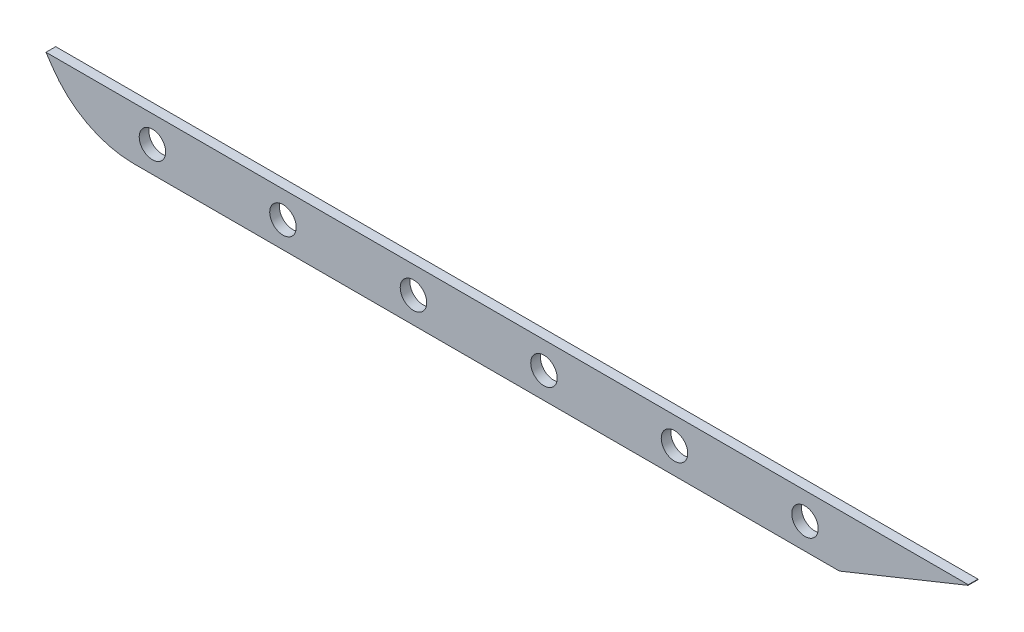
ISO-10303-21;
HEADER;
FILE_DESCRIPTION(('STEP AP214'),'2;1');
FILE_NAME('part.step','',(''),(''),'','','');
FILE_SCHEMA(('AUTOMOTIVE_DESIGN { 1 0 10303 214 1 1 1 1 }'));
ENDSEC;
DATA;
#1=APPLICATION_CONTEXT('core data for automotive mechanical design processes');
#2=APPLICATION_PROTOCOL_DEFINITION('international standard','automotive_design',2000,#1);
#3=PRODUCT_CONTEXT('',#1,'mechanical');
#4=PRODUCT('Part','Part','',(#3));
#5=PRODUCT_RELATED_PRODUCT_CATEGORY('part','',(#4));
#6=PRODUCT_DEFINITION_FORMATION('','',#4);
#7=PRODUCT_DEFINITION_CONTEXT('part definition',#1,'design');
#8=PRODUCT_DEFINITION('design','',#6,#7);
#9=PRODUCT_DEFINITION_SHAPE('','',#8);
#10=(LENGTH_UNIT() NAMED_UNIT(*) SI_UNIT(.MILLI.,.METRE.));
#11=(NAMED_UNIT(*) PLANE_ANGLE_UNIT() SI_UNIT($,.RADIAN.));
#12=(NAMED_UNIT(*) SI_UNIT($,.STERADIAN.) SOLID_ANGLE_UNIT());
#13=UNCERTAINTY_MEASURE_WITH_UNIT(LENGTH_MEASURE(1.E-05),#10,'distance_accuracy_value','');
#14=(GEOMETRIC_REPRESENTATION_CONTEXT(3) GLOBAL_UNCERTAINTY_ASSIGNED_CONTEXT((#13)) GLOBAL_UNIT_ASSIGNED_CONTEXT((#10,
#11,#12)) REPRESENTATION_CONTEXT('',''));
#15=CARTESIAN_POINT('',(0.,0.,0.));
#16=DIRECTION('',(0.,0.,1.));
#17=DIRECTION('',(1.,0.,0.));
#18=AXIS2_PLACEMENT_3D('',#15,#16,#17);
#19=CARTESIAN_POINT('',(428.120588235294,28.9396179466764,4.7625));
#20=DIRECTION('',(0.970193019893108,-0.242333456523632,0.));
#21=DIRECTION('',(0.242333456523632,0.970193019893108,0.));
#22=AXIS2_PLACEMENT_3D('',#19,#20,#21);
#23=PLANE('',#22);
#24=DIRECTION('',(0.,0.,1.));
#25=VECTOR('',#24,1.);
#26=CARTESIAN_POINT('',(403.198019602024,-70.8390196078432,-5.2375));
#27=LINE('',#26,#25);
#28=CARTESIAN_POINT('',(403.198019602024,-70.8390196078432,0.));
#29=VERTEX_POINT('',#28);
#30=CARTESIAN_POINT('',(403.198019602024,-70.8390196078432,4.7625));
#31=VERTEX_POINT('',#30);
#32=EDGE_CURVE('E61',#29,#31,#27,.T.);
#33=ORIENTED_EDGE('',*,*,#32,.T.);
#34=DIRECTION('',(-0.242333456523632,-0.970193019893108,0.));
#35=VECTOR('',#34,1.);
#36=CARTESIAN_POINT('',(428.120588235294,28.9396179466764,4.7625));
#37=LINE('',#36,#35);
#38=CARTESIAN_POINT('',(403.120588235294,-71.1490196078431,4.7625));
#39=VERTEX_POINT('',#38);
#40=EDGE_CURVE('E114',#31,#39,#37,.T.);
#41=ORIENTED_EDGE('',*,*,#40,.T.);
#42=DIRECTION('',(0.,0.,-1.));
#43=VECTOR('',#42,1.);
#44=CARTESIAN_POINT('',(403.120588235294,-71.1490196078431,4.7625));
#45=LINE('',#44,#43);
#46=CARTESIAN_POINT('',(403.120588235294,-71.1490196078431,0.));
#47=VERTEX_POINT('',#46);
#48=EDGE_CURVE('E122',#39,#47,#45,.T.);
#49=ORIENTED_EDGE('',*,*,#48,.T.);
#50=DIRECTION('',(-0.242333456523632,-0.970193019893108,0.));
#51=VECTOR('',#50,1.);
#52=CARTESIAN_POINT('',(428.120588235294,28.9396179466764,0.));
#53=LINE('',#52,#51);
#54=EDGE_CURVE('E134',#29,#47,#53,.T.);
#55=ORIENTED_EDGE('',*,*,#54,.F.);
#56=EDGE_LOOP('',(#33,#41,#49,#55));
#57=FACE_BOUND('',#56,.T.);
#58=ADVANCED_FACE('F45',(#57),#23,.T.);
#59=CARTESIAN_POINT('',(-98.8794117647059,3.85098039215685,4.7625));
#60=DIRECTION('',(-0.832050294337848,-0.554700196225223,0.));
#61=DIRECTION('',(0.554700196225223,-0.832050294337848,0.));
#62=AXIS2_PLACEMENT_3D('',#59,#60,#61);
#63=PLANE('',#62);
#64=DIRECTION('',(0.,0.,1.));
#65=VECTOR('',#64,1.);
#66=CARTESIAN_POINT('',(-49.0860784313726,-70.8390196078432,-5.2375));
#67=LINE('',#66,#65);
#68=CARTESIAN_POINT('',(-49.0860784313726,-70.8390196078432,0.));
#69=VERTEX_POINT('',#68);
#70=CARTESIAN_POINT('',(-49.0860784313726,-70.8390196078432,4.7625));
#71=VERTEX_POINT('',#70);
#72=EDGE_CURVE('E97',#69,#71,#67,.T.);
#73=ORIENTED_EDGE('',*,*,#72,.F.);
#74=DIRECTION('',(-0.554700196225223,0.832050294337848,0.));
#75=VECTOR('',#74,1.);
#76=CARTESIAN_POINT('',(-98.8794117647059,3.85098039215685,0.));
#77=LINE('',#76,#75);
#78=CARTESIAN_POINT('',(-46.1290054854995,-75.2746290266539,0.));
#79=VERTEX_POINT('',#78);
#80=EDGE_CURVE('E142',#79,#69,#77,.T.);
#81=ORIENTED_EDGE('',*,*,#80,.F.);
#82=DIRECTION('',(0.,0.,-1.));
#83=VECTOR('',#82,1.);
#84=CARTESIAN_POINT('',(-46.1290054854995,-75.2746290266539,4.7625));
#85=LINE('',#84,#83);
#86=CARTESIAN_POINT('',(-46.129005485499,-75.2746290266536,4.7625));
#87=VERTEX_POINT('',#86);
#88=EDGE_CURVE('E119',#79,#87,#85,.F.);
#89=ORIENTED_EDGE('',*,*,#88,.T.);
#90=DIRECTION('',(0.554700196225229,-0.832050294337844,0.));
#91=VECTOR('',#90,1.);
#92=CARTESIAN_POINT('',(-98.8794117647059,3.85098039215685,4.7625));
#93=LINE('',#92,#91);
#94=EDGE_CURVE('E111',#71,#87,#93,.T.);
#95=ORIENTED_EDGE('',*,*,#94,.F.);
#96=EDGE_LOOP('',(#73,#81,#89,#95));
#97=FACE_BOUND('',#96,.T.);
#98=ADVANCED_FACE('F117',(#97),#63,.T.);
#99=CARTESIAN_POINT('',(-31.8794117647059,-96.6490196078432,4.7625));
#100=DIRECTION('',(0.,1.,0.));
#101=DIRECTION('',(-1.,0.,0.));
#102=AXIS2_PLACEMENT_3D('',#99,#100,#101);
#103=PLANE('',#102);
#104=DIRECTION('',(1.,0.,0.));
#105=VECTOR('',#104,1.);
#106=CARTESIAN_POINT('',(-31.8794117647059,-96.6490196078432,0.));
#107=LINE('',#106,#105);
#108=CARTESIAN_POINT('',(-6.19059135728281,-96.6490196078432,0.));
#109=VERTEX_POINT('',#108);
#110=CARTESIAN_POINT('',(340.005873473177,-96.6490196078432,0.));
#111=VERTEX_POINT('',#110);
#112=EDGE_CURVE('E137',#109,#111,#107,.T.);
#113=ORIENTED_EDGE('',*,*,#112,.T.);
#114=DIRECTION('',(0.,0.,1.));
#115=VECTOR('',#114,1.);
#116=CARTESIAN_POINT('',(340.005873473177,-96.6490196078432,-5.2375));
#117=LINE('',#116,#115);
#118=CARTESIAN_POINT('',(340.005873473177,-96.6490196078432,4.7625));
#119=VERTEX_POINT('',#118);
#120=EDGE_CURVE('E68',#111,#119,#117,.T.);
#121=ORIENTED_EDGE('',*,*,#120,.T.);
#122=DIRECTION('',(1.,0.,0.));
#123=VECTOR('',#122,1.);
#124=CARTESIAN_POINT('',(-31.8794117647059,-96.6490196078432,4.7625));
#125=LINE('',#124,#123);
#126=CARTESIAN_POINT('',(-6.19059135728281,-96.6490196078432,4.7625));
#127=VERTEX_POINT('',#126);
#128=EDGE_CURVE('E123',#127,#119,#125,.T.);
#129=ORIENTED_EDGE('',*,*,#128,.F.);
#130=DIRECTION('',(0.,0.,-1.));
#131=VECTOR('',#130,1.);
#132=CARTESIAN_POINT('',(-6.19059135728281,-96.6490196078432,0.));
#133=LINE('',#132,#131);
#134=EDGE_CURVE('E128',#127,#109,#133,.T.);
#135=ORIENTED_EDGE('',*,*,#134,.T.);
#136=EDGE_LOOP('',(#113,#121,#129,#135));
#137=FACE_BOUND('',#136,.T.);
#138=ADVANCED_FACE('F162',(#137),#103,.F.);
#139=CARTESIAN_POINT('',(0.,0.,4.7625));
#140=DIRECTION('',(0.,0.,1.));
#141=DIRECTION('',(1.,0.,0.));
#142=AXIS2_PLACEMENT_3D('',#139,#140,#141);
#143=PLANE('',#142);
#144=DIRECTION('',(1.,0.,0.));
#145=VECTOR('',#144,1.);
#146=CARTESIAN_POINT('',(-49.0860784313726,-70.8390196078432,4.7625));
#147=LINE('',#146,#145);
#148=EDGE_CURVE('E100',#71,#31,#147,.T.);
#149=ORIENTED_EDGE('',*,*,#148,.F.);
#150=ORIENTED_EDGE('',*,*,#94,.T.);
#151=CARTESIAN_POINT('',(-6.19059135728282,-48.6490196078432,4.7625));
#152=DIRECTION('',(0.,0.,1.));
#153=DIRECTION('',(1.,0.,0.));
#154=AXIS2_PLACEMENT_3D('',#151,#152,#153);
#155=CIRCLE('',#154,48.);
#156=EDGE_CURVE('E153',#87,#127,#155,.T.);
#157=ORIENTED_EDGE('',*,*,#156,.T.);
#158=ORIENTED_EDGE('',*,*,#128,.T.);
#159=DIRECTION('',(-0.92718385456679,-0.374606593415906,0.));
#160=VECTOR('',#159,1.);
#161=CARTESIAN_POINT('',(403.120588235294,-71.1490196078431,4.7625));
#162=LINE('',#161,#160);
#163=EDGE_CURVE('E168',#39,#119,#162,.T.);
#164=ORIENTED_EDGE('',*,*,#163,.F.);
#165=ORIENTED_EDGE('',*,*,#40,.F.);
#166=EDGE_LOOP('',(#149,#150,#157,#158,#164,#165));
#167=FACE_BOUND('',#166,.T.);
#168=CARTESIAN_POINT('',(3.1205882352941,-83.8990196078432,4.7625));
#169=DIRECTION('',(0.,0.,1.));
#170=DIRECTION('',(1.,0.,0.));
#171=AXIS2_PLACEMENT_3D('',#168,#169,#170);
#172=CIRCLE('',#171,6.50000000000001);
#173=CARTESIAN_POINT('',(-3.37941176470591,-83.8990196078432,4.7625));
#174=VERTEX_POINT('',#173);
#175=EDGE_CURVE('E138',#174,#174,#172,.T.);
#176=ORIENTED_EDGE('',*,*,#175,.F.);
#177=EDGE_LOOP('',(#176));
#178=FACE_BOUND('',#177,.T.);
#179=CARTESIAN_POINT('',(67.1205882352941,-83.8990196078433,4.7625));
#180=DIRECTION('',(0.,0.,1.));
#181=DIRECTION('',(1.,0.,0.));
#182=AXIS2_PLACEMENT_3D('',#179,#180,#181);
#183=CIRCLE('',#182,6.5);
#184=CARTESIAN_POINT('',(60.6205882352941,-83.8990196078433,4.7625));
#185=VERTEX_POINT('',#184);
#186=EDGE_CURVE('E188',#185,#185,#183,.T.);
#187=ORIENTED_EDGE('',*,*,#186,.F.);
#188=EDGE_LOOP('',(#187));
#189=FACE_BOUND('',#188,.T.);
#190=CARTESIAN_POINT('',(131.120588235294,-83.8990196078432,4.7625));
#191=DIRECTION('',(0.,0.,1.));
#192=DIRECTION('',(1.,0.,0.));
#193=AXIS2_PLACEMENT_3D('',#190,#191,#192);
#194=CIRCLE('',#193,6.50000000000002);
#195=CARTESIAN_POINT('',(124.620588235294,-83.8990196078432,4.7625));
#196=VERTEX_POINT('',#195);
#197=EDGE_CURVE('E196',#196,#196,#194,.T.);
#198=ORIENTED_EDGE('',*,*,#197,.F.);
#199=EDGE_LOOP('',(#198));
#200=FACE_BOUND('',#199,.T.);
#201=CARTESIAN_POINT('',(195.120588235294,-83.8990196078432,4.7625));
#202=DIRECTION('',(0.,0.,1.));
#203=DIRECTION('',(1.,0.,0.));
#204=AXIS2_PLACEMENT_3D('',#201,#202,#203);
#205=CIRCLE('',#204,6.50000000000002);
#206=CARTESIAN_POINT('',(188.620588235294,-83.8990196078432,4.7625));
#207=VERTEX_POINT('',#206);
#208=EDGE_CURVE('E204',#207,#207,#205,.T.);
#209=ORIENTED_EDGE('',*,*,#208,.F.);
#210=EDGE_LOOP('',(#209));
#211=FACE_BOUND('',#210,.T.);
#212=CARTESIAN_POINT('',(259.120588235294,-83.8990196078432,4.7625));
#213=DIRECTION('',(0.,0.,1.));
#214=DIRECTION('',(1.,0.,0.));
#215=AXIS2_PLACEMENT_3D('',#212,#213,#214);
#216=CIRCLE('',#215,6.50000000000002);
#217=CARTESIAN_POINT('',(252.620588235294,-83.8990196078432,4.7625));
#218=VERTEX_POINT('',#217);
#219=EDGE_CURVE('E212',#218,#218,#216,.T.);
#220=ORIENTED_EDGE('',*,*,#219,.F.);
#221=EDGE_LOOP('',(#220));
#222=FACE_BOUND('',#221,.T.);
#223=CARTESIAN_POINT('',(323.120588235294,-83.8990196078432,4.7625));
#224=DIRECTION('',(0.,0.,1.));
#225=DIRECTION('',(1.,0.,0.));
#226=AXIS2_PLACEMENT_3D('',#223,#224,#225);
#227=CIRCLE('',#226,6.50000000000002);
#228=CARTESIAN_POINT('',(316.620588235294,-83.8990196078432,4.7625));
#229=VERTEX_POINT('',#228);
#230=EDGE_CURVE('E173',#229,#229,#227,.T.);
#231=ORIENTED_EDGE('',*,*,#230,.F.);
#232=EDGE_LOOP('',(#231));
#233=FACE_BOUND('',#232,.T.);
#234=ADVANCED_FACE('F109',(#167,#178,#189,#200,#211,#222,#233),#143,.T.);
#235=CARTESIAN_POINT('',(0.,0.,0.));
#236=DIRECTION('',(0.,0.,1.));
#237=DIRECTION('',(1.,0.,0.));
#238=AXIS2_PLACEMENT_3D('',#235,#236,#237);
#239=PLANE('',#238);
#240=CARTESIAN_POINT('',(3.1205882352941,-83.8990196078432,0.));
#241=DIRECTION('',(0.,0.,1.));
#242=DIRECTION('',(1.,0.,0.));
#243=AXIS2_PLACEMENT_3D('',#240,#241,#242);
#244=CIRCLE('',#243,6.50000000000001);
#245=CARTESIAN_POINT('',(-3.37941176470591,-83.8990196078432,0.));
#246=VERTEX_POINT('',#245);
#247=EDGE_CURVE('E180',#246,#246,#244,.T.);
#248=ORIENTED_EDGE('',*,*,#247,.T.);
#249=EDGE_LOOP('',(#248));
#250=FACE_BOUND('',#249,.T.);
#251=CARTESIAN_POINT('',(67.1205882352941,-83.8990196078433,0.));
#252=DIRECTION('',(0.,0.,1.));
#253=DIRECTION('',(1.,0.,0.));
#254=AXIS2_PLACEMENT_3D('',#251,#252,#253);
#255=CIRCLE('',#254,6.5);
#256=CARTESIAN_POINT('',(60.6205882352941,-83.8990196078433,0.));
#257=VERTEX_POINT('',#256);
#258=EDGE_CURVE('E184',#257,#257,#255,.T.);
#259=ORIENTED_EDGE('',*,*,#258,.T.);
#260=EDGE_LOOP('',(#259));
#261=FACE_BOUND('',#260,.T.);
#262=CARTESIAN_POINT('',(131.120588235294,-83.8990196078432,0.));
#263=DIRECTION('',(0.,0.,1.));
#264=DIRECTION('',(1.,0.,0.));
#265=AXIS2_PLACEMENT_3D('',#262,#263,#264);
#266=CIRCLE('',#265,6.50000000000002);
#267=CARTESIAN_POINT('',(124.620588235294,-83.8990196078432,0.));
#268=VERTEX_POINT('',#267);
#269=EDGE_CURVE('E192',#268,#268,#266,.T.);
#270=ORIENTED_EDGE('',*,*,#269,.T.);
#271=EDGE_LOOP('',(#270));
#272=FACE_BOUND('',#271,.T.);
#273=CARTESIAN_POINT('',(195.120588235294,-83.8990196078432,0.));
#274=DIRECTION('',(0.,0.,1.));
#275=DIRECTION('',(1.,0.,0.));
#276=AXIS2_PLACEMENT_3D('',#273,#274,#275);
#277=CIRCLE('',#276,6.50000000000002);
#278=CARTESIAN_POINT('',(188.620588235294,-83.8990196078432,0.));
#279=VERTEX_POINT('',#278);
#280=EDGE_CURVE('E200',#279,#279,#277,.T.);
#281=ORIENTED_EDGE('',*,*,#280,.T.);
#282=EDGE_LOOP('',(#281));
#283=FACE_BOUND('',#282,.T.);
#284=CARTESIAN_POINT('',(259.120588235294,-83.8990196078432,0.));
#285=DIRECTION('',(0.,0.,1.));
#286=DIRECTION('',(1.,0.,0.));
#287=AXIS2_PLACEMENT_3D('',#284,#285,#286);
#288=CIRCLE('',#287,6.50000000000002);
#289=CARTESIAN_POINT('',(252.620588235294,-83.8990196078432,0.));
#290=VERTEX_POINT('',#289);
#291=EDGE_CURVE('E208',#290,#290,#288,.T.);
#292=ORIENTED_EDGE('',*,*,#291,.T.);
#293=EDGE_LOOP('',(#292));
#294=FACE_BOUND('',#293,.T.);
#295=CARTESIAN_POINT('',(323.120588235294,-83.8990196078432,0.));
#296=DIRECTION('',(0.,0.,1.));
#297=DIRECTION('',(1.,0.,0.));
#298=AXIS2_PLACEMENT_3D('',#295,#296,#297);
#299=CIRCLE('',#298,6.50000000000002);
#300=CARTESIAN_POINT('',(316.620588235294,-83.8990196078432,0.));
#301=VERTEX_POINT('',#300);
#302=EDGE_CURVE('E216',#301,#301,#299,.T.);
#303=ORIENTED_EDGE('',*,*,#302,.T.);
#304=EDGE_LOOP('',(#303));
#305=FACE_BOUND('',#304,.T.);
#306=ORIENTED_EDGE('',*,*,#80,.T.);
#307=DIRECTION('',(1.,0.,0.));
#308=VECTOR('',#307,1.);
#309=CARTESIAN_POINT('',(0.,-70.8390196078432,0.));
#310=LINE('',#309,#308);
#311=EDGE_CURVE('E11',#69,#29,#310,.T.);
#312=ORIENTED_EDGE('',*,*,#311,.T.);
#313=ORIENTED_EDGE('',*,*,#54,.T.);
#314=DIRECTION('',(-0.92718385456679,-0.374606593415906,0.));
#315=VECTOR('',#314,1.);
#316=CARTESIAN_POINT('',(81.2820834011268,-201.180216044419,0.));
#317=LINE('',#316,#315);
#318=EDGE_CURVE('E54',#47,#111,#317,.T.);
#319=ORIENTED_EDGE('',*,*,#318,.T.);
#320=ORIENTED_EDGE('',*,*,#112,.F.);
#321=CARTESIAN_POINT('',(-6.19059135728282,-48.6490196078432,0.));
#322=DIRECTION('',(0.,0.,1.));
#323=DIRECTION('',(1.,0.,0.));
#324=AXIS2_PLACEMENT_3D('',#321,#322,#323);
#325=CIRCLE('',#324,48.);
#326=EDGE_CURVE('E148',#109,#79,#325,.F.);
#327=ORIENTED_EDGE('',*,*,#326,.T.);
#328=EDGE_LOOP('',(#306,#312,#313,#319,#320,#327));
#329=FACE_BOUND('',#328,.T.);
#330=ADVANCED_FACE('F158',(#250,#261,#272,#283,#294,#305,#329),#239,.F.);
#331=CARTESIAN_POINT('',(323.120588235294,-83.8990196078432,4.7625));
#332=DIRECTION('',(0.,0.,-1.));
#333=DIRECTION('',(-1.,0.,0.));
#334=AXIS2_PLACEMENT_3D('',#331,#332,#333);
#335=CYLINDRICAL_SURFACE('',#334,6.50000000000002);
#336=CARTESIAN_POINT('',(316.620588235294,-83.8990196078432,4.7625));
#337=CARTESIAN_POINT('',(316.620588235294,-83.8990196078432,4.712890625));
#338=CARTESIAN_POINT('',(316.620588235294,-83.8990196078432,4.66328125));
#339=CARTESIAN_POINT('',(316.620588235294,-83.8990196078432,4.5640625));
#340=CARTESIAN_POINT('',(316.620588235294,-83.8990196078432,4.514453125));
#341=CARTESIAN_POINT('',(316.620588235294,-83.8990196078432,4.415234375));
#342=CARTESIAN_POINT('',(316.620588235294,-83.8990196078432,4.365625));
#343=CARTESIAN_POINT('',(316.620588235294,-83.8990196078432,4.26640625));
#344=CARTESIAN_POINT('',(316.620588235294,-83.8990196078432,4.216796875));
#345=CARTESIAN_POINT('',(316.620588235294,-83.8990196078432,4.117578125));
#346=CARTESIAN_POINT('',(316.620588235294,-83.8990196078432,4.06796875));
#347=CARTESIAN_POINT('',(316.620588235294,-83.8990196078432,3.96875));
#348=CARTESIAN_POINT('',(316.620588235294,-83.8990196078432,3.919140625));
#349=CARTESIAN_POINT('',(316.620588235294,-83.8990196078432,3.819921875));
#350=CARTESIAN_POINT('',(316.620588235294,-83.8990196078432,3.7703125));
#351=CARTESIAN_POINT('',(316.620588235294,-83.8990196078432,3.67109375));
#352=CARTESIAN_POINT('',(316.620588235294,-83.8990196078432,3.621484375));
#353=CARTESIAN_POINT('',(316.620588235294,-83.8990196078432,3.522265625));
#354=CARTESIAN_POINT('',(316.620588235294,-83.8990196078432,3.47265625));
#355=CARTESIAN_POINT('',(316.620588235294,-83.8990196078432,3.3734375));
#356=CARTESIAN_POINT('',(316.620588235294,-83.8990196078432,3.323828125));
#357=CARTESIAN_POINT('',(316.620588235294,-83.8990196078432,3.224609375));
#358=CARTESIAN_POINT('',(316.620588235294,-83.8990196078432,3.175));
#359=CARTESIAN_POINT('',(316.620588235294,-83.8990196078432,3.07578125));
#360=CARTESIAN_POINT('',(316.620588235294,-83.8990196078432,3.026171875));
#361=CARTESIAN_POINT('',(316.620588235294,-83.8990196078432,2.926953125));
#362=CARTESIAN_POINT('',(316.620588235294,-83.8990196078432,2.87734375));
#363=CARTESIAN_POINT('',(316.620588235294,-83.8990196078432,2.778125));
#364=CARTESIAN_POINT('',(316.620588235294,-83.8990196078432,2.728515625));
#365=CARTESIAN_POINT('',(316.620588235294,-83.8990196078432,2.629296875));
#366=CARTESIAN_POINT('',(316.620588235294,-83.8990196078432,2.5796875));
#367=CARTESIAN_POINT('',(316.620588235294,-83.8990196078432,2.48046875));
#368=CARTESIAN_POINT('',(316.620588235294,-83.8990196078432,2.430859375));
#369=CARTESIAN_POINT('',(316.620588235294,-83.8990196078432,2.331640625));
#370=CARTESIAN_POINT('',(316.620588235294,-83.8990196078432,2.28203125));
#371=CARTESIAN_POINT('',(316.620588235294,-83.8990196078432,2.1828125));
#372=CARTESIAN_POINT('',(316.620588235294,-83.8990196078432,2.133203125));
#373=CARTESIAN_POINT('',(316.620588235294,-83.8990196078432,2.033984375));
#374=CARTESIAN_POINT('',(316.620588235294,-83.8990196078432,1.984375));
#375=CARTESIAN_POINT('',(316.620588235294,-83.8990196078432,1.88515625));
#376=CARTESIAN_POINT('',(316.620588235294,-83.8990196078432,1.835546875));
#377=CARTESIAN_POINT('',(316.620588235294,-83.8990196078432,1.736328125));
#378=CARTESIAN_POINT('',(316.620588235294,-83.8990196078432,1.68671875));
#379=CARTESIAN_POINT('',(316.620588235294,-83.8990196078432,1.5875));
#380=CARTESIAN_POINT('',(316.620588235294,-83.8990196078432,1.537890625));
#381=CARTESIAN_POINT('',(316.620588235294,-83.8990196078432,1.438671875));
#382=CARTESIAN_POINT('',(316.620588235294,-83.8990196078432,1.3890625));
#383=CARTESIAN_POINT('',(316.620588235294,-83.8990196078432,1.28984375));
#384=CARTESIAN_POINT('',(316.620588235294,-83.8990196078432,1.240234375));
#385=CARTESIAN_POINT('',(316.620588235294,-83.8990196078432,1.141015625));
#386=CARTESIAN_POINT('',(316.620588235294,-83.8990196078432,1.09140625));
#387=CARTESIAN_POINT('',(316.620588235294,-83.8990196078432,0.992187499999999));
#388=CARTESIAN_POINT('',(316.620588235294,-83.8990196078432,0.942578124999999));
#389=CARTESIAN_POINT('',(316.620588235294,-83.8990196078432,0.843359375));
#390=CARTESIAN_POINT('',(316.620588235294,-83.8990196078432,0.79375));
#391=CARTESIAN_POINT('',(316.620588235294,-83.8990196078432,0.69453125));
#392=CARTESIAN_POINT('',(316.620588235294,-83.8990196078432,0.644921875));
#393=CARTESIAN_POINT('',(316.620588235294,-83.8990196078432,0.545703125));
#394=CARTESIAN_POINT('',(316.620588235294,-83.8990196078432,0.49609375));
#395=CARTESIAN_POINT('',(316.620588235294,-83.8990196078432,0.396875));
#396=CARTESIAN_POINT('',(316.620588235294,-83.8990196078432,0.347265625));
#397=CARTESIAN_POINT('',(316.620588235294,-83.8990196078432,0.248046875));
#398=CARTESIAN_POINT('',(316.620588235294,-83.8990196078432,0.1984375));
#399=CARTESIAN_POINT('',(316.620588235294,-83.8990196078432,0.09921875));
#400=CARTESIAN_POINT('',(316.620588235294,-83.8990196078432,0.049609375));
#401=CARTESIAN_POINT('',(316.620588235294,-83.8990196078432,0.));
#402=B_SPLINE_CURVE_WITH_KNOTS('',3,(#336,#337,#338,#339,#340,#341,#342,#343,#344,#345,#346,
#347,#348,#349,#350,#351,#352,#353,#354,#355,#356,#357,#358,#359,#360,#361,#362,#363,#364,#365,
#366,#367,#368,#369,#370,#371,#372,#373,#374,#375,#376,#377,#378,#379,#380,#381,#382,#383,#384,
#385,#386,#387,#388,#389,#390,#391,#392,#393,#394,#395,#396,#397,#398,#399,#400,#401),
.UNSPECIFIED.,.F.,.F.,(4,2,2,2,2,2,2,2,2,2,2,2,2,2,2,2,2,2,2,2,2,2,2,2,2,2,2,2,2,2,2,2,4),(0.,
0.148828125,0.29765625,0.446484375,0.5953125,0.744140625,0.892968750000001,1.041796875,1.190625,
1.339453125,1.48828125,1.637109375,1.7859375,1.934765625,2.08359375,2.232421875,2.38125,
2.530078125,2.67890625,2.827734375,2.9765625,3.125390625,3.27421875,3.423046875,3.571875,
3.720703125,3.86953125,4.018359375,4.1671875,4.316015625,4.46484375,4.613671875,4.7625),.UNSPECIFIED.);
#403=EDGE_CURVE('BSEAM225',#229,#301,#402,.T.);
#404=ORIENTED_EDGE('',*,*,#230,.T.);
#405=ORIENTED_EDGE('',*,*,#302,.F.);
#406=ORIENTED_EDGE('',*,*,#403,.T.);
#407=ORIENTED_EDGE('',*,*,#403,.F.);
#408=EDGE_LOOP('',(#404,#406,#405,#407));
#409=FACE_BOUND('',#408,.T.);
#410=ADVANCED_FACE('F225',(#409),#335,.F.);
#411=CARTESIAN_POINT('',(259.120588235294,-83.8990196078432,4.7625));
#412=DIRECTION('',(0.,0.,-1.));
#413=DIRECTION('',(-1.,0.,0.));
#414=AXIS2_PLACEMENT_3D('',#411,#412,#413);
#415=CYLINDRICAL_SURFACE('',#414,6.50000000000002);
#416=CARTESIAN_POINT('',(252.620588235294,-83.8990196078432,4.7625));
#417=CARTESIAN_POINT('',(252.620588235294,-83.8990196078432,4.712890625));
#418=CARTESIAN_POINT('',(252.620588235294,-83.8990196078432,4.66328125));
#419=CARTESIAN_POINT('',(252.620588235294,-83.8990196078432,4.5640625));
#420=CARTESIAN_POINT('',(252.620588235294,-83.8990196078432,4.514453125));
#421=CARTESIAN_POINT('',(252.620588235294,-83.8990196078432,4.415234375));
#422=CARTESIAN_POINT('',(252.620588235294,-83.8990196078432,4.365625));
#423=CARTESIAN_POINT('',(252.620588235294,-83.8990196078432,4.26640625));
#424=CARTESIAN_POINT('',(252.620588235294,-83.8990196078432,4.216796875));
#425=CARTESIAN_POINT('',(252.620588235294,-83.8990196078432,4.117578125));
#426=CARTESIAN_POINT('',(252.620588235294,-83.8990196078432,4.06796875));
#427=CARTESIAN_POINT('',(252.620588235294,-83.8990196078432,3.96875));
#428=CARTESIAN_POINT('',(252.620588235294,-83.8990196078432,3.919140625));
#429=CARTESIAN_POINT('',(252.620588235294,-83.8990196078432,3.819921875));
#430=CARTESIAN_POINT('',(252.620588235294,-83.8990196078432,3.7703125));
#431=CARTESIAN_POINT('',(252.620588235294,-83.8990196078432,3.67109375));
#432=CARTESIAN_POINT('',(252.620588235294,-83.8990196078432,3.621484375));
#433=CARTESIAN_POINT('',(252.620588235294,-83.8990196078432,3.522265625));
#434=CARTESIAN_POINT('',(252.620588235294,-83.8990196078432,3.47265625));
#435=CARTESIAN_POINT('',(252.620588235294,-83.8990196078432,3.3734375));
#436=CARTESIAN_POINT('',(252.620588235294,-83.8990196078432,3.323828125));
#437=CARTESIAN_POINT('',(252.620588235294,-83.8990196078432,3.224609375));
#438=CARTESIAN_POINT('',(252.620588235294,-83.8990196078432,3.175));
#439=CARTESIAN_POINT('',(252.620588235294,-83.8990196078432,3.07578125));
#440=CARTESIAN_POINT('',(252.620588235294,-83.8990196078432,3.026171875));
#441=CARTESIAN_POINT('',(252.620588235294,-83.8990196078432,2.926953125));
#442=CARTESIAN_POINT('',(252.620588235294,-83.8990196078432,2.87734375));
#443=CARTESIAN_POINT('',(252.620588235294,-83.8990196078432,2.778125));
#444=CARTESIAN_POINT('',(252.620588235294,-83.8990196078432,2.728515625));
#445=CARTESIAN_POINT('',(252.620588235294,-83.8990196078432,2.629296875));
#446=CARTESIAN_POINT('',(252.620588235294,-83.8990196078432,2.5796875));
#447=CARTESIAN_POINT('',(252.620588235294,-83.8990196078432,2.48046875));
#448=CARTESIAN_POINT('',(252.620588235294,-83.8990196078432,2.430859375));
#449=CARTESIAN_POINT('',(252.620588235294,-83.8990196078432,2.331640625));
#450=CARTESIAN_POINT('',(252.620588235294,-83.8990196078432,2.28203125));
#451=CARTESIAN_POINT('',(252.620588235294,-83.8990196078432,2.1828125));
#452=CARTESIAN_POINT('',(252.620588235294,-83.8990196078432,2.133203125));
#453=CARTESIAN_POINT('',(252.620588235294,-83.8990196078432,2.033984375));
#454=CARTESIAN_POINT('',(252.620588235294,-83.8990196078432,1.984375));
#455=CARTESIAN_POINT('',(252.620588235294,-83.8990196078432,1.88515625));
#456=CARTESIAN_POINT('',(252.620588235294,-83.8990196078432,1.835546875));
#457=CARTESIAN_POINT('',(252.620588235294,-83.8990196078432,1.736328125));
#458=CARTESIAN_POINT('',(252.620588235294,-83.8990196078432,1.68671875));
#459=CARTESIAN_POINT('',(252.620588235294,-83.8990196078432,1.5875));
#460=CARTESIAN_POINT('',(252.620588235294,-83.8990196078432,1.537890625));
#461=CARTESIAN_POINT('',(252.620588235294,-83.8990196078432,1.438671875));
#462=CARTESIAN_POINT('',(252.620588235294,-83.8990196078432,1.3890625));
#463=CARTESIAN_POINT('',(252.620588235294,-83.8990196078432,1.28984375));
#464=CARTESIAN_POINT('',(252.620588235294,-83.8990196078432,1.240234375));
#465=CARTESIAN_POINT('',(252.620588235294,-83.8990196078432,1.141015625));
#466=CARTESIAN_POINT('',(252.620588235294,-83.8990196078432,1.09140625));
#467=CARTESIAN_POINT('',(252.620588235294,-83.8990196078432,0.992187499999999));
#468=CARTESIAN_POINT('',(252.620588235294,-83.8990196078432,0.942578124999999));
#469=CARTESIAN_POINT('',(252.620588235294,-83.8990196078432,0.843359375));
#470=CARTESIAN_POINT('',(252.620588235294,-83.8990196078432,0.79375));
#471=CARTESIAN_POINT('',(252.620588235294,-83.8990196078432,0.69453125));
#472=CARTESIAN_POINT('',(252.620588235294,-83.8990196078432,0.644921875));
#473=CARTESIAN_POINT('',(252.620588235294,-83.8990196078432,0.545703125));
#474=CARTESIAN_POINT('',(252.620588235294,-83.8990196078432,0.49609375));
#475=CARTESIAN_POINT('',(252.620588235294,-83.8990196078432,0.396875));
#476=CARTESIAN_POINT('',(252.620588235294,-83.8990196078432,0.347265625));
#477=CARTESIAN_POINT('',(252.620588235294,-83.8990196078432,0.248046875));
#478=CARTESIAN_POINT('',(252.620588235294,-83.8990196078432,0.1984375));
#479=CARTESIAN_POINT('',(252.620588235294,-83.8990196078432,0.09921875));
#480=CARTESIAN_POINT('',(252.620588235294,-83.8990196078432,0.049609375));
#481=CARTESIAN_POINT('',(252.620588235294,-83.8990196078432,0.));
#482=B_SPLINE_CURVE_WITH_KNOTS('',3,(#416,#417,#418,#419,#420,#421,#422,#423,#424,#425,#426,
#427,#428,#429,#430,#431,#432,#433,#434,#435,#436,#437,#438,#439,#440,#441,#442,#443,#444,#445,
#446,#447,#448,#449,#450,#451,#452,#453,#454,#455,#456,#457,#458,#459,#460,#461,#462,#463,#464,
#465,#466,#467,#468,#469,#470,#471,#472,#473,#474,#475,#476,#477,#478,#479,#480,#481),
.UNSPECIFIED.,.F.,.F.,(4,2,2,2,2,2,2,2,2,2,2,2,2,2,2,2,2,2,2,2,2,2,2,2,2,2,2,2,2,2,2,2,4),(0.,
0.148828125,0.29765625,0.446484375,0.5953125,0.744140625,0.892968750000001,1.041796875,1.190625,
1.339453125,1.48828125,1.637109375,1.7859375,1.934765625,2.08359375,2.232421875,2.38125,
2.530078125,2.67890625,2.827734375,2.9765625,3.125390625,3.27421875,3.423046875,3.571875,
3.720703125,3.86953125,4.018359375,4.1671875,4.316015625,4.46484375,4.613671875,4.7625),.UNSPECIFIED.);
#483=EDGE_CURVE('BSEAM276',#218,#290,#482,.T.);
#484=ORIENTED_EDGE('',*,*,#219,.T.);
#485=ORIENTED_EDGE('',*,*,#291,.F.);
#486=ORIENTED_EDGE('',*,*,#483,.T.);
#487=ORIENTED_EDGE('',*,*,#483,.F.);
#488=EDGE_LOOP('',(#484,#486,#485,#487));
#489=FACE_BOUND('',#488,.T.);
#490=ADVANCED_FACE('F276',(#489),#415,.F.);
#491=CARTESIAN_POINT('',(195.120588235294,-83.8990196078432,4.7625));
#492=DIRECTION('',(0.,0.,-1.));
#493=DIRECTION('',(-1.,0.,0.));
#494=AXIS2_PLACEMENT_3D('',#491,#492,#493);
#495=CYLINDRICAL_SURFACE('',#494,6.50000000000002);
#496=CARTESIAN_POINT('',(188.620588235294,-83.8990196078432,4.7625));
#497=CARTESIAN_POINT('',(188.620588235294,-83.8990196078432,4.712890625));
#498=CARTESIAN_POINT('',(188.620588235294,-83.8990196078432,4.66328125));
#499=CARTESIAN_POINT('',(188.620588235294,-83.8990196078432,4.5640625));
#500=CARTESIAN_POINT('',(188.620588235294,-83.8990196078432,4.514453125));
#501=CARTESIAN_POINT('',(188.620588235294,-83.8990196078432,4.415234375));
#502=CARTESIAN_POINT('',(188.620588235294,-83.8990196078432,4.365625));
#503=CARTESIAN_POINT('',(188.620588235294,-83.8990196078432,4.26640625));
#504=CARTESIAN_POINT('',(188.620588235294,-83.8990196078432,4.216796875));
#505=CARTESIAN_POINT('',(188.620588235294,-83.8990196078432,4.117578125));
#506=CARTESIAN_POINT('',(188.620588235294,-83.8990196078432,4.06796875));
#507=CARTESIAN_POINT('',(188.620588235294,-83.8990196078432,3.96875));
#508=CARTESIAN_POINT('',(188.620588235294,-83.8990196078432,3.919140625));
#509=CARTESIAN_POINT('',(188.620588235294,-83.8990196078432,3.819921875));
#510=CARTESIAN_POINT('',(188.620588235294,-83.8990196078432,3.7703125));
#511=CARTESIAN_POINT('',(188.620588235294,-83.8990196078432,3.67109375));
#512=CARTESIAN_POINT('',(188.620588235294,-83.8990196078432,3.621484375));
#513=CARTESIAN_POINT('',(188.620588235294,-83.8990196078432,3.522265625));
#514=CARTESIAN_POINT('',(188.620588235294,-83.8990196078432,3.47265625));
#515=CARTESIAN_POINT('',(188.620588235294,-83.8990196078432,3.3734375));
#516=CARTESIAN_POINT('',(188.620588235294,-83.8990196078432,3.323828125));
#517=CARTESIAN_POINT('',(188.620588235294,-83.8990196078432,3.224609375));
#518=CARTESIAN_POINT('',(188.620588235294,-83.8990196078432,3.175));
#519=CARTESIAN_POINT('',(188.620588235294,-83.8990196078432,3.07578125));
#520=CARTESIAN_POINT('',(188.620588235294,-83.8990196078432,3.026171875));
#521=CARTESIAN_POINT('',(188.620588235294,-83.8990196078432,2.926953125));
#522=CARTESIAN_POINT('',(188.620588235294,-83.8990196078432,2.87734375));
#523=CARTESIAN_POINT('',(188.620588235294,-83.8990196078432,2.778125));
#524=CARTESIAN_POINT('',(188.620588235294,-83.8990196078432,2.728515625));
#525=CARTESIAN_POINT('',(188.620588235294,-83.8990196078432,2.629296875));
#526=CARTESIAN_POINT('',(188.620588235294,-83.8990196078432,2.5796875));
#527=CARTESIAN_POINT('',(188.620588235294,-83.8990196078432,2.48046875));
#528=CARTESIAN_POINT('',(188.620588235294,-83.8990196078432,2.430859375));
#529=CARTESIAN_POINT('',(188.620588235294,-83.8990196078432,2.331640625));
#530=CARTESIAN_POINT('',(188.620588235294,-83.8990196078432,2.28203125));
#531=CARTESIAN_POINT('',(188.620588235294,-83.8990196078432,2.1828125));
#532=CARTESIAN_POINT('',(188.620588235294,-83.8990196078432,2.133203125));
#533=CARTESIAN_POINT('',(188.620588235294,-83.8990196078432,2.033984375));
#534=CARTESIAN_POINT('',(188.620588235294,-83.8990196078432,1.984375));
#535=CARTESIAN_POINT('',(188.620588235294,-83.8990196078432,1.88515625));
#536=CARTESIAN_POINT('',(188.620588235294,-83.8990196078432,1.835546875));
#537=CARTESIAN_POINT('',(188.620588235294,-83.8990196078432,1.736328125));
#538=CARTESIAN_POINT('',(188.620588235294,-83.8990196078432,1.68671875));
#539=CARTESIAN_POINT('',(188.620588235294,-83.8990196078432,1.5875));
#540=CARTESIAN_POINT('',(188.620588235294,-83.8990196078432,1.537890625));
#541=CARTESIAN_POINT('',(188.620588235294,-83.8990196078432,1.438671875));
#542=CARTESIAN_POINT('',(188.620588235294,-83.8990196078432,1.3890625));
#543=CARTESIAN_POINT('',(188.620588235294,-83.8990196078432,1.28984375));
#544=CARTESIAN_POINT('',(188.620588235294,-83.8990196078432,1.240234375));
#545=CARTESIAN_POINT('',(188.620588235294,-83.8990196078432,1.141015625));
#546=CARTESIAN_POINT('',(188.620588235294,-83.8990196078432,1.09140625));
#547=CARTESIAN_POINT('',(188.620588235294,-83.8990196078432,0.992187499999999));
#548=CARTESIAN_POINT('',(188.620588235294,-83.8990196078432,0.942578124999999));
#549=CARTESIAN_POINT('',(188.620588235294,-83.8990196078432,0.843359375));
#550=CARTESIAN_POINT('',(188.620588235294,-83.8990196078432,0.79375));
#551=CARTESIAN_POINT('',(188.620588235294,-83.8990196078432,0.69453125));
#552=CARTESIAN_POINT('',(188.620588235294,-83.8990196078432,0.644921875));
#553=CARTESIAN_POINT('',(188.620588235294,-83.8990196078432,0.545703125));
#554=CARTESIAN_POINT('',(188.620588235294,-83.8990196078432,0.49609375));
#555=CARTESIAN_POINT('',(188.620588235294,-83.8990196078432,0.396875));
#556=CARTESIAN_POINT('',(188.620588235294,-83.8990196078432,0.347265625));
#557=CARTESIAN_POINT('',(188.620588235294,-83.8990196078432,0.248046875));
#558=CARTESIAN_POINT('',(188.620588235294,-83.8990196078432,0.1984375));
#559=CARTESIAN_POINT('',(188.620588235294,-83.8990196078432,0.09921875));
#560=CARTESIAN_POINT('',(188.620588235294,-83.8990196078432,0.049609375));
#561=CARTESIAN_POINT('',(188.620588235294,-83.8990196078432,0.));
#562=B_SPLINE_CURVE_WITH_KNOTS('',3,(#496,#497,#498,#499,#500,#501,#502,#503,#504,#505,#506,
#507,#508,#509,#510,#511,#512,#513,#514,#515,#516,#517,#518,#519,#520,#521,#522,#523,#524,#525,
#526,#527,#528,#529,#530,#531,#532,#533,#534,#535,#536,#537,#538,#539,#540,#541,#542,#543,#544,
#545,#546,#547,#548,#549,#550,#551,#552,#553,#554,#555,#556,#557,#558,#559,#560,#561),
.UNSPECIFIED.,.F.,.F.,(4,2,2,2,2,2,2,2,2,2,2,2,2,2,2,2,2,2,2,2,2,2,2,2,2,2,2,2,2,2,2,2,4),(0.,
0.148828125,0.29765625,0.446484375,0.5953125,0.744140625,0.892968750000001,1.041796875,1.190625,
1.339453125,1.48828125,1.637109375,1.7859375,1.934765625,2.08359375,2.232421875,2.38125,
2.530078125,2.67890625,2.827734375,2.9765625,3.125390625,3.27421875,3.423046875,3.571875,
3.720703125,3.86953125,4.018359375,4.1671875,4.316015625,4.46484375,4.613671875,4.7625),.UNSPECIFIED.);
#563=EDGE_CURVE('BSEAM284',#207,#279,#562,.T.);
#564=ORIENTED_EDGE('',*,*,#208,.T.);
#565=ORIENTED_EDGE('',*,*,#280,.F.);
#566=ORIENTED_EDGE('',*,*,#563,.T.);
#567=ORIENTED_EDGE('',*,*,#563,.F.);
#568=EDGE_LOOP('',(#564,#566,#565,#567));
#569=FACE_BOUND('',#568,.T.);
#570=ADVANCED_FACE('F284',(#569),#495,.F.);
#571=CARTESIAN_POINT('',(131.120588235294,-83.8990196078432,4.7625));
#572=DIRECTION('',(0.,0.,-1.));
#573=DIRECTION('',(-1.,0.,0.));
#574=AXIS2_PLACEMENT_3D('',#571,#572,#573);
#575=CYLINDRICAL_SURFACE('',#574,6.50000000000002);
#576=CARTESIAN_POINT('',(124.620588235294,-83.8990196078432,4.7625));
#577=CARTESIAN_POINT('',(124.620588235294,-83.8990196078432,4.712890625));
#578=CARTESIAN_POINT('',(124.620588235294,-83.8990196078432,4.66328125));
#579=CARTESIAN_POINT('',(124.620588235294,-83.8990196078432,4.5640625));
#580=CARTESIAN_POINT('',(124.620588235294,-83.8990196078432,4.514453125));
#581=CARTESIAN_POINT('',(124.620588235294,-83.8990196078432,4.415234375));
#582=CARTESIAN_POINT('',(124.620588235294,-83.8990196078432,4.365625));
#583=CARTESIAN_POINT('',(124.620588235294,-83.8990196078432,4.26640625));
#584=CARTESIAN_POINT('',(124.620588235294,-83.8990196078432,4.216796875));
#585=CARTESIAN_POINT('',(124.620588235294,-83.8990196078432,4.117578125));
#586=CARTESIAN_POINT('',(124.620588235294,-83.8990196078432,4.06796875));
#587=CARTESIAN_POINT('',(124.620588235294,-83.8990196078432,3.96875));
#588=CARTESIAN_POINT('',(124.620588235294,-83.8990196078432,3.919140625));
#589=CARTESIAN_POINT('',(124.620588235294,-83.8990196078432,3.819921875));
#590=CARTESIAN_POINT('',(124.620588235294,-83.8990196078432,3.7703125));
#591=CARTESIAN_POINT('',(124.620588235294,-83.8990196078432,3.67109375));
#592=CARTESIAN_POINT('',(124.620588235294,-83.8990196078432,3.621484375));
#593=CARTESIAN_POINT('',(124.620588235294,-83.8990196078432,3.522265625));
#594=CARTESIAN_POINT('',(124.620588235294,-83.8990196078432,3.47265625));
#595=CARTESIAN_POINT('',(124.620588235294,-83.8990196078432,3.3734375));
#596=CARTESIAN_POINT('',(124.620588235294,-83.8990196078432,3.323828125));
#597=CARTESIAN_POINT('',(124.620588235294,-83.8990196078432,3.224609375));
#598=CARTESIAN_POINT('',(124.620588235294,-83.8990196078432,3.175));
#599=CARTESIAN_POINT('',(124.620588235294,-83.8990196078432,3.07578125));
#600=CARTESIAN_POINT('',(124.620588235294,-83.8990196078432,3.026171875));
#601=CARTESIAN_POINT('',(124.620588235294,-83.8990196078432,2.926953125));
#602=CARTESIAN_POINT('',(124.620588235294,-83.8990196078432,2.87734375));
#603=CARTESIAN_POINT('',(124.620588235294,-83.8990196078432,2.778125));
#604=CARTESIAN_POINT('',(124.620588235294,-83.8990196078432,2.728515625));
#605=CARTESIAN_POINT('',(124.620588235294,-83.8990196078432,2.629296875));
#606=CARTESIAN_POINT('',(124.620588235294,-83.8990196078432,2.5796875));
#607=CARTESIAN_POINT('',(124.620588235294,-83.8990196078432,2.48046875));
#608=CARTESIAN_POINT('',(124.620588235294,-83.8990196078432,2.430859375));
#609=CARTESIAN_POINT('',(124.620588235294,-83.8990196078432,2.331640625));
#610=CARTESIAN_POINT('',(124.620588235294,-83.8990196078432,2.28203125));
#611=CARTESIAN_POINT('',(124.620588235294,-83.8990196078432,2.1828125));
#612=CARTESIAN_POINT('',(124.620588235294,-83.8990196078432,2.133203125));
#613=CARTESIAN_POINT('',(124.620588235294,-83.8990196078432,2.033984375));
#614=CARTESIAN_POINT('',(124.620588235294,-83.8990196078432,1.984375));
#615=CARTESIAN_POINT('',(124.620588235294,-83.8990196078432,1.88515625));
#616=CARTESIAN_POINT('',(124.620588235294,-83.8990196078432,1.835546875));
#617=CARTESIAN_POINT('',(124.620588235294,-83.8990196078432,1.736328125));
#618=CARTESIAN_POINT('',(124.620588235294,-83.8990196078432,1.68671875));
#619=CARTESIAN_POINT('',(124.620588235294,-83.8990196078432,1.5875));
#620=CARTESIAN_POINT('',(124.620588235294,-83.8990196078432,1.537890625));
#621=CARTESIAN_POINT('',(124.620588235294,-83.8990196078432,1.438671875));
#622=CARTESIAN_POINT('',(124.620588235294,-83.8990196078432,1.3890625));
#623=CARTESIAN_POINT('',(124.620588235294,-83.8990196078432,1.28984375));
#624=CARTESIAN_POINT('',(124.620588235294,-83.8990196078432,1.240234375));
#625=CARTESIAN_POINT('',(124.620588235294,-83.8990196078432,1.141015625));
#626=CARTESIAN_POINT('',(124.620588235294,-83.8990196078432,1.09140625));
#627=CARTESIAN_POINT('',(124.620588235294,-83.8990196078432,0.992187499999999));
#628=CARTESIAN_POINT('',(124.620588235294,-83.8990196078432,0.942578124999999));
#629=CARTESIAN_POINT('',(124.620588235294,-83.8990196078432,0.843359375));
#630=CARTESIAN_POINT('',(124.620588235294,-83.8990196078432,0.79375));
#631=CARTESIAN_POINT('',(124.620588235294,-83.8990196078432,0.69453125));
#632=CARTESIAN_POINT('',(124.620588235294,-83.8990196078432,0.644921875));
#633=CARTESIAN_POINT('',(124.620588235294,-83.8990196078432,0.545703125));
#634=CARTESIAN_POINT('',(124.620588235294,-83.8990196078432,0.49609375));
#635=CARTESIAN_POINT('',(124.620588235294,-83.8990196078432,0.396875));
#636=CARTESIAN_POINT('',(124.620588235294,-83.8990196078432,0.347265625));
#637=CARTESIAN_POINT('',(124.620588235294,-83.8990196078432,0.248046875));
#638=CARTESIAN_POINT('',(124.620588235294,-83.8990196078432,0.1984375));
#639=CARTESIAN_POINT('',(124.620588235294,-83.8990196078432,0.09921875));
#640=CARTESIAN_POINT('',(124.620588235294,-83.8990196078432,0.049609375));
#641=CARTESIAN_POINT('',(124.620588235294,-83.8990196078432,0.));
#642=B_SPLINE_CURVE_WITH_KNOTS('',3,(#576,#577,#578,#579,#580,#581,#582,#583,#584,#585,#586,
#587,#588,#589,#590,#591,#592,#593,#594,#595,#596,#597,#598,#599,#600,#601,#602,#603,#604,#605,
#606,#607,#608,#609,#610,#611,#612,#613,#614,#615,#616,#617,#618,#619,#620,#621,#622,#623,#624,
#625,#626,#627,#628,#629,#630,#631,#632,#633,#634,#635,#636,#637,#638,#639,#640,#641),
.UNSPECIFIED.,.F.,.F.,(4,2,2,2,2,2,2,2,2,2,2,2,2,2,2,2,2,2,2,2,2,2,2,2,2,2,2,2,2,2,2,2,4),(0.,
0.148828125,0.29765625,0.446484375,0.5953125,0.744140625,0.892968750000001,1.041796875,1.190625,
1.339453125,1.48828125,1.637109375,1.7859375,1.934765625,2.08359375,2.232421875,2.38125,
2.530078125,2.67890625,2.827734375,2.9765625,3.125390625,3.27421875,3.423046875,3.571875,
3.720703125,3.86953125,4.018359375,4.1671875,4.316015625,4.46484375,4.613671875,4.7625),.UNSPECIFIED.);
#643=EDGE_CURVE('BSEAM294',#196,#268,#642,.T.);
#644=ORIENTED_EDGE('',*,*,#197,.T.);
#645=ORIENTED_EDGE('',*,*,#269,.F.);
#646=ORIENTED_EDGE('',*,*,#643,.T.);
#647=ORIENTED_EDGE('',*,*,#643,.F.);
#648=EDGE_LOOP('',(#644,#646,#645,#647));
#649=FACE_BOUND('',#648,.T.);
#650=ADVANCED_FACE('F294',(#649),#575,.F.);
#651=CARTESIAN_POINT('',(67.1205882352941,-83.8990196078433,4.7625));
#652=DIRECTION('',(0.,0.,-1.));
#653=DIRECTION('',(-1.,0.,0.));
#654=AXIS2_PLACEMENT_3D('',#651,#652,#653);
#655=CYLINDRICAL_SURFACE('',#654,6.5);
#656=CARTESIAN_POINT('',(60.6205882352941,-83.8990196078433,4.7625));
#657=CARTESIAN_POINT('',(60.6205882352941,-83.8990196078433,4.712890625));
#658=CARTESIAN_POINT('',(60.6205882352941,-83.8990196078433,4.66328125));
#659=CARTESIAN_POINT('',(60.6205882352941,-83.8990196078433,4.5640625));
#660=CARTESIAN_POINT('',(60.6205882352941,-83.8990196078433,4.514453125));
#661=CARTESIAN_POINT('',(60.6205882352941,-83.8990196078433,4.415234375));
#662=CARTESIAN_POINT('',(60.6205882352941,-83.8990196078433,4.365625));
#663=CARTESIAN_POINT('',(60.6205882352941,-83.8990196078433,4.26640625));
#664=CARTESIAN_POINT('',(60.6205882352941,-83.8990196078433,4.216796875));
#665=CARTESIAN_POINT('',(60.6205882352941,-83.8990196078433,4.117578125));
#666=CARTESIAN_POINT('',(60.6205882352941,-83.8990196078433,4.06796875));
#667=CARTESIAN_POINT('',(60.6205882352941,-83.8990196078433,3.96875));
#668=CARTESIAN_POINT('',(60.6205882352941,-83.8990196078433,3.919140625));
#669=CARTESIAN_POINT('',(60.6205882352941,-83.8990196078433,3.819921875));
#670=CARTESIAN_POINT('',(60.6205882352941,-83.8990196078433,3.7703125));
#671=CARTESIAN_POINT('',(60.6205882352941,-83.8990196078433,3.67109375));
#672=CARTESIAN_POINT('',(60.6205882352941,-83.8990196078433,3.621484375));
#673=CARTESIAN_POINT('',(60.6205882352941,-83.8990196078433,3.522265625));
#674=CARTESIAN_POINT('',(60.6205882352941,-83.8990196078433,3.47265625));
#675=CARTESIAN_POINT('',(60.6205882352941,-83.8990196078433,3.3734375));
#676=CARTESIAN_POINT('',(60.6205882352941,-83.8990196078433,3.323828125));
#677=CARTESIAN_POINT('',(60.6205882352941,-83.8990196078433,3.224609375));
#678=CARTESIAN_POINT('',(60.6205882352941,-83.8990196078433,3.175));
#679=CARTESIAN_POINT('',(60.6205882352941,-83.8990196078433,3.07578125));
#680=CARTESIAN_POINT('',(60.6205882352941,-83.8990196078433,3.026171875));
#681=CARTESIAN_POINT('',(60.6205882352941,-83.8990196078433,2.926953125));
#682=CARTESIAN_POINT('',(60.6205882352941,-83.8990196078433,2.87734375));
#683=CARTESIAN_POINT('',(60.6205882352941,-83.8990196078433,2.778125));
#684=CARTESIAN_POINT('',(60.6205882352941,-83.8990196078433,2.728515625));
#685=CARTESIAN_POINT('',(60.6205882352941,-83.8990196078433,2.629296875));
#686=CARTESIAN_POINT('',(60.6205882352941,-83.8990196078433,2.5796875));
#687=CARTESIAN_POINT('',(60.6205882352941,-83.8990196078433,2.48046875));
#688=CARTESIAN_POINT('',(60.6205882352941,-83.8990196078433,2.430859375));
#689=CARTESIAN_POINT('',(60.6205882352941,-83.8990196078433,2.331640625));
#690=CARTESIAN_POINT('',(60.6205882352941,-83.8990196078433,2.28203125));
#691=CARTESIAN_POINT('',(60.6205882352941,-83.8990196078433,2.1828125));
#692=CARTESIAN_POINT('',(60.6205882352941,-83.8990196078433,2.133203125));
#693=CARTESIAN_POINT('',(60.6205882352941,-83.8990196078433,2.033984375));
#694=CARTESIAN_POINT('',(60.6205882352941,-83.8990196078433,1.984375));
#695=CARTESIAN_POINT('',(60.6205882352941,-83.8990196078433,1.88515625));
#696=CARTESIAN_POINT('',(60.6205882352941,-83.8990196078433,1.835546875));
#697=CARTESIAN_POINT('',(60.6205882352941,-83.8990196078433,1.736328125));
#698=CARTESIAN_POINT('',(60.6205882352941,-83.8990196078433,1.68671875));
#699=CARTESIAN_POINT('',(60.6205882352941,-83.8990196078433,1.5875));
#700=CARTESIAN_POINT('',(60.6205882352941,-83.8990196078433,1.537890625));
#701=CARTESIAN_POINT('',(60.6205882352941,-83.8990196078433,1.438671875));
#702=CARTESIAN_POINT('',(60.6205882352941,-83.8990196078433,1.3890625));
#703=CARTESIAN_POINT('',(60.6205882352941,-83.8990196078433,1.28984375));
#704=CARTESIAN_POINT('',(60.6205882352941,-83.8990196078433,1.240234375));
#705=CARTESIAN_POINT('',(60.6205882352941,-83.8990196078433,1.141015625));
#706=CARTESIAN_POINT('',(60.6205882352941,-83.8990196078433,1.09140625));
#707=CARTESIAN_POINT('',(60.6205882352941,-83.8990196078433,0.992187499999999));
#708=CARTESIAN_POINT('',(60.6205882352941,-83.8990196078433,0.942578124999999));
#709=CARTESIAN_POINT('',(60.6205882352941,-83.8990196078433,0.843359375));
#710=CARTESIAN_POINT('',(60.6205882352941,-83.8990196078433,0.79375));
#711=CARTESIAN_POINT('',(60.6205882352941,-83.8990196078433,0.69453125));
#712=CARTESIAN_POINT('',(60.6205882352941,-83.8990196078433,0.644921875));
#713=CARTESIAN_POINT('',(60.6205882352941,-83.8990196078433,0.545703125));
#714=CARTESIAN_POINT('',(60.6205882352941,-83.8990196078433,0.49609375));
#715=CARTESIAN_POINT('',(60.6205882352941,-83.8990196078433,0.396875));
#716=CARTESIAN_POINT('',(60.6205882352941,-83.8990196078433,0.347265625));
#717=CARTESIAN_POINT('',(60.6205882352941,-83.8990196078433,0.248046875));
#718=CARTESIAN_POINT('',(60.6205882352941,-83.8990196078433,0.1984375));
#719=CARTESIAN_POINT('',(60.6205882352941,-83.8990196078433,0.09921875));
#720=CARTESIAN_POINT('',(60.6205882352941,-83.8990196078433,0.049609375));
#721=CARTESIAN_POINT('',(60.6205882352941,-83.8990196078433,0.));
#722=B_SPLINE_CURVE_WITH_KNOTS('',3,(#656,#657,#658,#659,#660,#661,#662,#663,#664,#665,#666,
#667,#668,#669,#670,#671,#672,#673,#674,#675,#676,#677,#678,#679,#680,#681,#682,#683,#684,#685,
#686,#687,#688,#689,#690,#691,#692,#693,#694,#695,#696,#697,#698,#699,#700,#701,#702,#703,#704,
#705,#706,#707,#708,#709,#710,#711,#712,#713,#714,#715,#716,#717,#718,#719,#720,#721),
.UNSPECIFIED.,.F.,.F.,(4,2,2,2,2,2,2,2,2,2,2,2,2,2,2,2,2,2,2,2,2,2,2,2,2,2,2,2,2,2,2,2,4),(0.,
0.148828125,0.29765625,0.446484375,0.5953125,0.744140625,0.892968750000001,1.041796875,1.190625,
1.339453125,1.48828125,1.637109375,1.7859375,1.934765625,2.08359375,2.232421875,2.38125,
2.530078125,2.67890625,2.827734375,2.9765625,3.125390625,3.27421875,3.423046875,3.571875,
3.720703125,3.86953125,4.018359375,4.1671875,4.316015625,4.46484375,4.613671875,4.7625),.UNSPECIFIED.);
#723=EDGE_CURVE('BSEAM304',#185,#257,#722,.T.);
#724=ORIENTED_EDGE('',*,*,#186,.T.);
#725=ORIENTED_EDGE('',*,*,#258,.F.);
#726=ORIENTED_EDGE('',*,*,#723,.T.);
#727=ORIENTED_EDGE('',*,*,#723,.F.);
#728=EDGE_LOOP('',(#724,#726,#725,#727));
#729=FACE_BOUND('',#728,.T.);
#730=ADVANCED_FACE('F304',(#729),#655,.F.);
#731=CARTESIAN_POINT('',(3.1205882352941,-83.8990196078432,4.7625));
#732=DIRECTION('',(0.,0.,-1.));
#733=DIRECTION('',(-1.,0.,0.));
#734=AXIS2_PLACEMENT_3D('',#731,#732,#733);
#735=CYLINDRICAL_SURFACE('',#734,6.50000000000001);
#736=CARTESIAN_POINT('',(-3.37941176470591,-83.8990196078432,4.7625));
#737=CARTESIAN_POINT('',(-3.37941176470591,-83.8990196078432,4.712890625));
#738=CARTESIAN_POINT('',(-3.37941176470591,-83.8990196078432,4.66328125));
#739=CARTESIAN_POINT('',(-3.37941176470591,-83.8990196078432,4.5640625));
#740=CARTESIAN_POINT('',(-3.37941176470591,-83.8990196078432,4.514453125));
#741=CARTESIAN_POINT('',(-3.37941176470591,-83.8990196078432,4.415234375));
#742=CARTESIAN_POINT('',(-3.37941176470591,-83.8990196078432,4.365625));
#743=CARTESIAN_POINT('',(-3.37941176470591,-83.8990196078432,4.26640625));
#744=CARTESIAN_POINT('',(-3.37941176470591,-83.8990196078432,4.216796875));
#745=CARTESIAN_POINT('',(-3.37941176470591,-83.8990196078432,4.117578125));
#746=CARTESIAN_POINT('',(-3.37941176470591,-83.8990196078432,4.06796875));
#747=CARTESIAN_POINT('',(-3.37941176470591,-83.8990196078432,3.96875));
#748=CARTESIAN_POINT('',(-3.37941176470591,-83.8990196078432,3.919140625));
#749=CARTESIAN_POINT('',(-3.37941176470591,-83.8990196078432,3.819921875));
#750=CARTESIAN_POINT('',(-3.37941176470591,-83.8990196078432,3.7703125));
#751=CARTESIAN_POINT('',(-3.37941176470591,-83.8990196078432,3.67109375));
#752=CARTESIAN_POINT('',(-3.37941176470591,-83.8990196078432,3.621484375));
#753=CARTESIAN_POINT('',(-3.37941176470591,-83.8990196078432,3.522265625));
#754=CARTESIAN_POINT('',(-3.37941176470591,-83.8990196078432,3.47265625));
#755=CARTESIAN_POINT('',(-3.37941176470591,-83.8990196078432,3.3734375));
#756=CARTESIAN_POINT('',(-3.37941176470591,-83.8990196078432,3.323828125));
#757=CARTESIAN_POINT('',(-3.37941176470591,-83.8990196078432,3.224609375));
#758=CARTESIAN_POINT('',(-3.37941176470591,-83.8990196078432,3.175));
#759=CARTESIAN_POINT('',(-3.37941176470591,-83.8990196078432,3.07578125));
#760=CARTESIAN_POINT('',(-3.37941176470591,-83.8990196078432,3.026171875));
#761=CARTESIAN_POINT('',(-3.37941176470591,-83.8990196078432,2.926953125));
#762=CARTESIAN_POINT('',(-3.37941176470591,-83.8990196078432,2.87734375));
#763=CARTESIAN_POINT('',(-3.37941176470591,-83.8990196078432,2.778125));
#764=CARTESIAN_POINT('',(-3.37941176470591,-83.8990196078432,2.728515625));
#765=CARTESIAN_POINT('',(-3.37941176470591,-83.8990196078432,2.629296875));
#766=CARTESIAN_POINT('',(-3.37941176470591,-83.8990196078432,2.5796875));
#767=CARTESIAN_POINT('',(-3.37941176470591,-83.8990196078432,2.48046875));
#768=CARTESIAN_POINT('',(-3.37941176470591,-83.8990196078432,2.430859375));
#769=CARTESIAN_POINT('',(-3.37941176470591,-83.8990196078432,2.331640625));
#770=CARTESIAN_POINT('',(-3.37941176470591,-83.8990196078432,2.28203125));
#771=CARTESIAN_POINT('',(-3.37941176470591,-83.8990196078432,2.1828125));
#772=CARTESIAN_POINT('',(-3.37941176470591,-83.8990196078432,2.133203125));
#773=CARTESIAN_POINT('',(-3.37941176470591,-83.8990196078432,2.033984375));
#774=CARTESIAN_POINT('',(-3.37941176470591,-83.8990196078432,1.984375));
#775=CARTESIAN_POINT('',(-3.37941176470591,-83.8990196078432,1.88515625));
#776=CARTESIAN_POINT('',(-3.37941176470591,-83.8990196078432,1.835546875));
#777=CARTESIAN_POINT('',(-3.37941176470591,-83.8990196078432,1.736328125));
#778=CARTESIAN_POINT('',(-3.37941176470591,-83.8990196078432,1.68671875));
#779=CARTESIAN_POINT('',(-3.37941176470591,-83.8990196078432,1.5875));
#780=CARTESIAN_POINT('',(-3.37941176470591,-83.8990196078432,1.537890625));
#781=CARTESIAN_POINT('',(-3.37941176470591,-83.8990196078432,1.438671875));
#782=CARTESIAN_POINT('',(-3.37941176470591,-83.8990196078432,1.3890625));
#783=CARTESIAN_POINT('',(-3.37941176470591,-83.8990196078432,1.28984375));
#784=CARTESIAN_POINT('',(-3.37941176470591,-83.8990196078432,1.240234375));
#785=CARTESIAN_POINT('',(-3.37941176470591,-83.8990196078432,1.141015625));
#786=CARTESIAN_POINT('',(-3.37941176470591,-83.8990196078432,1.09140625));
#787=CARTESIAN_POINT('',(-3.37941176470591,-83.8990196078432,0.992187499999999));
#788=CARTESIAN_POINT('',(-3.37941176470591,-83.8990196078432,0.942578124999999));
#789=CARTESIAN_POINT('',(-3.37941176470591,-83.8990196078432,0.843359375));
#790=CARTESIAN_POINT('',(-3.37941176470591,-83.8990196078432,0.79375));
#791=CARTESIAN_POINT('',(-3.37941176470591,-83.8990196078432,0.69453125));
#792=CARTESIAN_POINT('',(-3.37941176470591,-83.8990196078432,0.644921875));
#793=CARTESIAN_POINT('',(-3.37941176470591,-83.8990196078432,0.545703125));
#794=CARTESIAN_POINT('',(-3.37941176470591,-83.8990196078432,0.49609375));
#795=CARTESIAN_POINT('',(-3.37941176470591,-83.8990196078432,0.396875));
#796=CARTESIAN_POINT('',(-3.37941176470591,-83.8990196078432,0.347265625));
#797=CARTESIAN_POINT('',(-3.37941176470591,-83.8990196078432,0.248046875));
#798=CARTESIAN_POINT('',(-3.37941176470591,-83.8990196078432,0.1984375));
#799=CARTESIAN_POINT('',(-3.37941176470591,-83.8990196078432,0.09921875));
#800=CARTESIAN_POINT('',(-3.37941176470591,-83.8990196078432,0.049609375));
#801=CARTESIAN_POINT('',(-3.37941176470591,-83.8990196078432,0.));
#802=B_SPLINE_CURVE_WITH_KNOTS('',3,(#736,#737,#738,#739,#740,#741,#742,#743,#744,#745,#746,
#747,#748,#749,#750,#751,#752,#753,#754,#755,#756,#757,#758,#759,#760,#761,#762,#763,#764,#765,
#766,#767,#768,#769,#770,#771,#772,#773,#774,#775,#776,#777,#778,#779,#780,#781,#782,#783,#784,
#785,#786,#787,#788,#789,#790,#791,#792,#793,#794,#795,#796,#797,#798,#799,#800,#801),
.UNSPECIFIED.,.F.,.F.,(4,2,2,2,2,2,2,2,2,2,2,2,2,2,2,2,2,2,2,2,2,2,2,2,2,2,2,2,2,2,2,2,4),(0.,
0.148828125,0.29765625,0.446484375,0.5953125,0.744140625,0.892968750000001,1.041796875,1.190625,
1.339453125,1.48828125,1.637109375,1.7859375,1.934765625,2.08359375,2.232421875,2.38125,
2.530078125,2.67890625,2.827734375,2.9765625,3.125390625,3.27421875,3.423046875,3.571875,
3.720703125,3.86953125,4.018359375,4.1671875,4.316015625,4.46484375,4.613671875,4.7625),.UNSPECIFIED.);
#803=EDGE_CURVE('BSEAM314',#174,#246,#802,.T.);
#804=ORIENTED_EDGE('',*,*,#175,.T.);
#805=ORIENTED_EDGE('',*,*,#247,.F.);
#806=ORIENTED_EDGE('',*,*,#803,.T.);
#807=ORIENTED_EDGE('',*,*,#803,.F.);
#808=EDGE_LOOP('',(#804,#806,#805,#807));
#809=FACE_BOUND('',#808,.T.);
#810=ADVANCED_FACE('F314',(#809),#735,.F.);
#811=CARTESIAN_POINT('',(-6.19059135728282,-48.6490196078432,4.7625));
#812=DIRECTION('',(0.,0.,1.));
#813=DIRECTION('',(1.,0.,0.));
#814=AXIS2_PLACEMENT_3D('',#811,#812,#813);
#815=CYLINDRICAL_SURFACE('',#814,48.);
#816=ORIENTED_EDGE('',*,*,#156,.F.);
#817=ORIENTED_EDGE('',*,*,#88,.F.);
#818=ORIENTED_EDGE('',*,*,#326,.F.);
#819=ORIENTED_EDGE('',*,*,#134,.F.);
#820=EDGE_LOOP('',(#816,#817,#818,#819));
#821=FACE_BOUND('',#820,.T.);
#822=ADVANCED_FACE('F47',(#821),#815,.T.);
#823=CARTESIAN_POINT('',(403.120588235294,-71.1490196078431,-5.2375));
#824=DIRECTION('',(-0.374606593415906,0.92718385456679,0.));
#825=DIRECTION('',(-0.92718385456679,-0.374606593415906,0.));
#826=AXIS2_PLACEMENT_3D('',#823,#824,#825);
#827=PLANE('',#826);
#828=ORIENTED_EDGE('',*,*,#48,.F.);
#829=ORIENTED_EDGE('',*,*,#163,.T.);
#830=ORIENTED_EDGE('',*,*,#120,.F.);
#831=ORIENTED_EDGE('',*,*,#318,.F.);
#832=EDGE_LOOP('',(#828,#829,#830,#831));
#833=FACE_BOUND('',#832,.T.);
#834=ADVANCED_FACE('F167',(#833),#827,.F.);
#835=CARTESIAN_POINT('',(-49.0860784313726,-70.8390196078432,-5.2375));
#836=DIRECTION('',(0.,-1.,0.));
#837=DIRECTION('',(0.,0.,-1.));
#838=AXIS2_PLACEMENT_3D('',#835,#836,#837);
#839=PLANE('',#838);
#840=ORIENTED_EDGE('',*,*,#72,.T.);
#841=ORIENTED_EDGE('',*,*,#148,.T.);
#842=ORIENTED_EDGE('',*,*,#32,.F.);
#843=ORIENTED_EDGE('',*,*,#311,.F.);
#844=EDGE_LOOP('',(#840,#841,#842,#843));
#845=FACE_BOUND('',#844,.T.);
#846=ADVANCED_FACE('F99',(#845),#839,.F.);
#847=CLOSED_SHELL('',(#58,#98,#138,#234,#330,#410,#490,#570,#650,#730,#810,#822,#834,#846));
#848=MANIFOLD_SOLID_BREP('B2',#847);
#849=ADVANCED_BREP_SHAPE_REPRESENTATION('',(#18,#848),#14);
#850=SHAPE_DEFINITION_REPRESENTATION(#9,#849);
ENDSEC;
END-ISO-10303-21;
